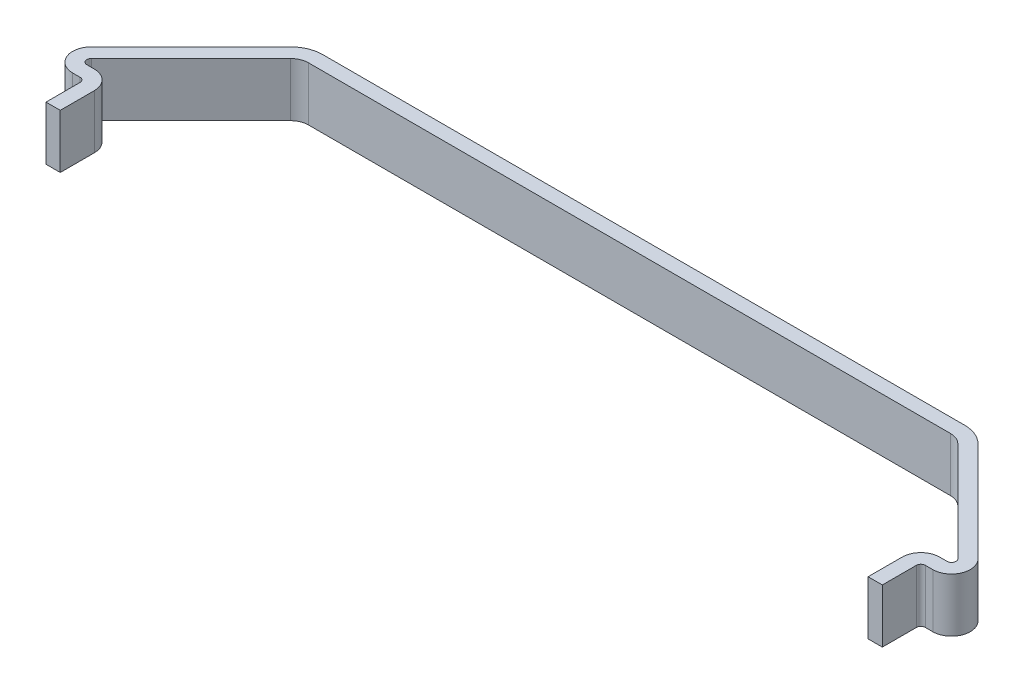
ISO-10303-21;
HEADER;
FILE_DESCRIPTION(('STEP AP214'),'2;1');
FILE_NAME('part.step','',(''),(''),'','','');
FILE_SCHEMA(('AUTOMOTIVE_DESIGN { 1 0 10303 214 1 1 1 1 }'));
ENDSEC;
DATA;
#1=APPLICATION_CONTEXT('core data for automotive mechanical design processes');
#2=APPLICATION_PROTOCOL_DEFINITION('international standard','automotive_design',2000,#1);
#3=PRODUCT_CONTEXT('',#1,'mechanical');
#4=PRODUCT('Part','Part','',(#3));
#5=PRODUCT_RELATED_PRODUCT_CATEGORY('part','',(#4));
#6=PRODUCT_DEFINITION_FORMATION('','',#4);
#7=PRODUCT_DEFINITION_CONTEXT('part definition',#1,'design');
#8=PRODUCT_DEFINITION('design','',#6,#7);
#9=PRODUCT_DEFINITION_SHAPE('','',#8);
#10=(LENGTH_UNIT() NAMED_UNIT(*) SI_UNIT(.MILLI.,.METRE.));
#11=(NAMED_UNIT(*) PLANE_ANGLE_UNIT() SI_UNIT($,.RADIAN.));
#12=(NAMED_UNIT(*) SI_UNIT($,.STERADIAN.) SOLID_ANGLE_UNIT());
#13=UNCERTAINTY_MEASURE_WITH_UNIT(LENGTH_MEASURE(1.E-05),#10,'distance_accuracy_value','');
#14=(GEOMETRIC_REPRESENTATION_CONTEXT(3) GLOBAL_UNCERTAINTY_ASSIGNED_CONTEXT((#13)) GLOBAL_UNIT_ASSIGNED_CONTEXT((#10,
#11,#12)) REPRESENTATION_CONTEXT('',''));
#15=CARTESIAN_POINT('',(0.,0.,0.));
#16=DIRECTION('',(0.,0.,1.));
#17=DIRECTION('',(1.,0.,0.));
#18=AXIS2_PLACEMENT_3D('',#15,#16,#17);
#19=CARTESIAN_POINT('',(-17.8795364376269,1.5,-10.70625));
#20=DIRECTION('',(0.,-1.,0.));
#21=DIRECTION('',(0.,0.,-1.));
#22=AXIS2_PLACEMENT_3D('',#19,#20,#21);
#23=CYLINDRICAL_SURFACE('',#22,1.79375);
#24=CARTESIAN_POINT('',(-17.8795364376269,-1.5,-10.70625));
#25=DIRECTION('',(0.,1.,0.));
#26=DIRECTION('',(0.,0.,1.));
#27=AXIS2_PLACEMENT_3D('',#24,#25,#26);
#28=CIRCLE('',#27,1.79375);
#29=CARTESIAN_POINT('',(-17.8795364376269,-1.5,-12.5));
#30=VERTEX_POINT('',#29);
#31=CARTESIAN_POINT('',(-19.1479092263802,-1.5,-11.9746227887534));
#32=VERTEX_POINT('',#31);
#33=EDGE_CURVE('E260',#30,#32,#28,.T.);
#34=ORIENTED_EDGE('',*,*,#33,.T.);
#35=DIRECTION('',(0.,-1.,0.));
#36=VECTOR('',#35,1.);
#37=CARTESIAN_POINT('',(-19.1479092263802,1.5,-11.9746227887534));
#38=LINE('',#37,#36);
#39=CARTESIAN_POINT('',(-19.1479092263802,1.5,-11.9746227887534));
#40=VERTEX_POINT('',#39);
#41=EDGE_CURVE('E11',#40,#32,#38,.T.);
#42=ORIENTED_EDGE('',*,*,#41,.F.);
#43=CARTESIAN_POINT('',(-17.8795364376269,1.5,-10.70625));
#44=DIRECTION('',(0.,1.,0.));
#45=DIRECTION('',(0.,0.,1.));
#46=AXIS2_PLACEMENT_3D('',#43,#44,#45);
#47=CIRCLE('',#46,1.79375);
#48=CARTESIAN_POINT('',(-17.8795364376269,1.5,-12.5));
#49=VERTEX_POINT('',#48);
#50=EDGE_CURVE('E342',#49,#40,#47,.T.);
#51=ORIENTED_EDGE('',*,*,#50,.F.);
#52=DIRECTION('',(0.,-1.,0.));
#53=VECTOR('',#52,1.);
#54=CARTESIAN_POINT('',(-17.8795364376269,1.5,-12.5));
#55=LINE('',#54,#53);
#56=EDGE_CURVE('E256',#49,#30,#55,.T.);
#57=ORIENTED_EDGE('',*,*,#56,.T.);
#58=EDGE_LOOP('',(#34,#42,#51,#57));
#59=FACE_BOUND('',#58,.T.);
#60=ADVANCED_FACE('F39',(#59),#23,.T.);
#61=CARTESIAN_POINT('',(-19.1479092263802,1.5,-11.9746227887534));
#62=DIRECTION('',(0.707106781186544,0.,0.707106781186551));
#63=DIRECTION('',(0.707106781186551,0.,-0.707106781186544));
#64=AXIS2_PLACEMENT_3D('',#61,#62,#63);
#65=PLANE('',#64);
#66=DIRECTION('',(-0.707106781186551,0.,0.707106781186544));
#67=VECTOR('',#66,1.);
#68=CARTESIAN_POINT('',(-19.1479092263802,-1.5,-11.9746227887534));
#69=LINE('',#68,#67);
#70=CARTESIAN_POINT('',(-24.6942927028635,-1.5,-6.42823931227021));
#71=VERTEX_POINT('',#70);
#72=EDGE_CURVE('E264',#32,#71,#69,.T.);
#73=ORIENTED_EDGE('',*,*,#72,.T.);
#74=DIRECTION('',(0.,-1.,0.));
#75=VECTOR('',#74,1.);
#76=CARTESIAN_POINT('',(-24.6942927028635,1.5,-6.42823931227021));
#77=LINE('',#76,#75);
#78=CARTESIAN_POINT('',(-24.6942927028635,1.5,-6.42823931227021));
#79=VERTEX_POINT('',#78);
#80=EDGE_CURVE('E48',#79,#71,#77,.T.);
#81=ORIENTED_EDGE('',*,*,#80,.F.);
#82=DIRECTION('',(-0.707106781186551,0.,0.707106781186544));
#83=VECTOR('',#82,1.);
#84=CARTESIAN_POINT('',(-19.1479092263802,1.5,-11.9746227887534));
#85=LINE('',#84,#83);
#86=EDGE_CURVE('E159',#40,#79,#85,.T.);
#87=ORIENTED_EDGE('',*,*,#86,.F.);
#88=ORIENTED_EDGE('',*,*,#41,.T.);
#89=EDGE_LOOP('',(#73,#81,#87,#88));
#90=FACE_BOUND('',#89,.T.);
#91=ADVANCED_FACE('F548',(#90),#65,.F.);
#92=CARTESIAN_POINT('',(-23.95625,1.5,-5.69019660940675));
#93=DIRECTION('',(0.,-1.,0.));
#94=DIRECTION('',(0.,0.,-1.));
#95=AXIS2_PLACEMENT_3D('',#92,#93,#94);
#96=CYLINDRICAL_SURFACE('',#95,1.04375);
#97=CARTESIAN_POINT('',(-23.95625,-1.5,-5.69019660940675));
#98=DIRECTION('',(0.,1.,0.));
#99=DIRECTION('',(0.,0.,-1.));
#100=AXIS2_PLACEMENT_3D('',#97,#98,#99);
#101=CIRCLE('',#100,1.04375);
#102=CARTESIAN_POINT('',(-23.95625,-1.5,-4.64644660940675));
#103=VERTEX_POINT('',#102);
#104=EDGE_CURVE('E267',#71,#103,#101,.T.);
#105=ORIENTED_EDGE('',*,*,#104,.T.);
#106=DIRECTION('',(0.,-1.,0.));
#107=VECTOR('',#106,1.);
#108=CARTESIAN_POINT('',(-23.95625,1.5,-4.64644660940675));
#109=LINE('',#108,#107);
#110=CARTESIAN_POINT('',(-23.95625,1.5,-4.64644660940675));
#111=VERTEX_POINT('',#110);
#112=EDGE_CURVE('E433',#111,#103,#109,.T.);
#113=ORIENTED_EDGE('',*,*,#112,.F.);
#114=CARTESIAN_POINT('',(-23.95625,1.5,-5.69019660940675));
#115=DIRECTION('',(0.,1.,0.));
#116=DIRECTION('',(0.,0.,-1.));
#117=AXIS2_PLACEMENT_3D('',#114,#115,#116);
#118=CIRCLE('',#117,1.04375);
#119=EDGE_CURVE('E443',#79,#111,#118,.T.);
#120=ORIENTED_EDGE('',*,*,#119,.F.);
#121=ORIENTED_EDGE('',*,*,#80,.T.);
#122=EDGE_LOOP('',(#105,#113,#120,#121));
#123=FACE_BOUND('',#122,.T.);
#124=ADVANCED_FACE('F441',(#123),#96,.T.);
#125=CARTESIAN_POINT('',(-23.95625,1.5,-4.64644660940675));
#126=DIRECTION('',(0.,0.,-1.));
#127=DIRECTION('',(-1.,0.,0.));
#128=AXIS2_PLACEMENT_3D('',#125,#126,#127);
#129=PLANE('',#128);
#130=DIRECTION('',(1.,0.,0.));
#131=VECTOR('',#130,1.);
#132=CARTESIAN_POINT('',(-23.95625,-1.5,-4.64644660940675));
#133=LINE('',#132,#131);
#134=CARTESIAN_POINT('',(-23.54375,-1.5,-4.64644660940675));
#135=VERTEX_POINT('',#134);
#136=EDGE_CURVE('E270',#103,#135,#133,.T.);
#137=ORIENTED_EDGE('',*,*,#136,.T.);
#138=DIRECTION('',(0.,-1.,0.));
#139=VECTOR('',#138,1.);
#140=CARTESIAN_POINT('',(-23.54375,1.5,-4.64644660940675));
#141=LINE('',#140,#139);
#142=CARTESIAN_POINT('',(-23.54375,1.5,-4.64644660940675));
#143=VERTEX_POINT('',#142);
#144=EDGE_CURVE('E429',#143,#135,#141,.T.);
#145=ORIENTED_EDGE('',*,*,#144,.F.);
#146=DIRECTION('',(1.,0.,0.));
#147=VECTOR('',#146,1.);
#148=CARTESIAN_POINT('',(-23.95625,1.5,-4.64644660940675));
#149=LINE('',#148,#147);
#150=EDGE_CURVE('E462',#111,#143,#149,.T.);
#151=ORIENTED_EDGE('',*,*,#150,.F.);
#152=ORIENTED_EDGE('',*,*,#112,.T.);
#153=EDGE_LOOP('',(#137,#145,#151,#152));
#154=FACE_BOUND('',#153,.T.);
#155=ADVANCED_FACE('F452',(#154),#129,.F.);
#156=CARTESIAN_POINT('',(-23.54375,1.5,-4.39644660940675));
#157=DIRECTION('',(0.,-1.,0.));
#158=DIRECTION('',(0.,0.,-1.));
#159=AXIS2_PLACEMENT_3D('',#156,#157,#158);
#160=CYLINDRICAL_SURFACE('',#159,0.25);
#161=CARTESIAN_POINT('',(-23.54375,-1.5,-4.39644660940675));
#162=DIRECTION('',(0.,-1.,0.));
#163=DIRECTION('',(0.,0.,-1.));
#164=AXIS2_PLACEMENT_3D('',#161,#162,#163);
#165=CIRCLE('',#164,0.25);
#166=CARTESIAN_POINT('',(-23.29375,-1.5,-4.39644660940675));
#167=VERTEX_POINT('',#166);
#168=EDGE_CURVE('E273',#135,#167,#165,.T.);
#169=ORIENTED_EDGE('',*,*,#168,.T.);
#170=DIRECTION('',(0.,-1.,0.));
#171=VECTOR('',#170,1.);
#172=CARTESIAN_POINT('',(-23.29375,1.5,-4.39644660940675));
#173=LINE('',#172,#171);
#174=CARTESIAN_POINT('',(-23.29375,1.5,-4.39644660940675));
#175=VERTEX_POINT('',#174);
#176=EDGE_CURVE('E425',#175,#167,#173,.T.);
#177=ORIENTED_EDGE('',*,*,#176,.F.);
#178=CARTESIAN_POINT('',(-23.54375,1.5,-4.39644660940675));
#179=DIRECTION('',(0.,-1.,0.));
#180=DIRECTION('',(0.,0.,-1.));
#181=AXIS2_PLACEMENT_3D('',#178,#179,#180);
#182=CIRCLE('',#181,0.25);
#183=EDGE_CURVE('E458',#143,#175,#182,.T.);
#184=ORIENTED_EDGE('',*,*,#183,.F.);
#185=ORIENTED_EDGE('',*,*,#144,.T.);
#186=EDGE_LOOP('',(#169,#177,#184,#185));
#187=FACE_BOUND('',#186,.T.);
#188=ADVANCED_FACE('F456',(#187),#160,.F.);
#189=CARTESIAN_POINT('',(-23.29375,1.5,-4.39644660940675));
#190=DIRECTION('',(1.,0.,0.));
#191=DIRECTION('',(0.,0.,-1.));
#192=AXIS2_PLACEMENT_3D('',#189,#190,#191);
#193=PLANE('',#192);
#194=DIRECTION('',(0.,0.,1.));
#195=VECTOR('',#194,1.);
#196=CARTESIAN_POINT('',(-23.29375,-1.5,-4.39644660940675));
#197=LINE('',#196,#195);
#198=CARTESIAN_POINT('',(-23.29375,-1.5,-2.5));
#199=VERTEX_POINT('',#198);
#200=EDGE_CURVE('E276',#167,#199,#197,.T.);
#201=ORIENTED_EDGE('',*,*,#200,.T.);
#202=DIRECTION('',(0.,-1.,0.));
#203=VECTOR('',#202,1.);
#204=CARTESIAN_POINT('',(-23.29375,1.5,-2.5));
#205=LINE('',#204,#203);
#206=CARTESIAN_POINT('',(-23.29375,1.5,-2.5));
#207=VERTEX_POINT('',#206);
#208=EDGE_CURVE('E421',#207,#199,#205,.T.);
#209=ORIENTED_EDGE('',*,*,#208,.F.);
#210=DIRECTION('',(0.,0.,1.));
#211=VECTOR('',#210,1.);
#212=CARTESIAN_POINT('',(-23.29375,1.5,-4.39644660940675));
#213=LINE('',#212,#211);
#214=EDGE_CURVE('E461',#175,#207,#213,.T.);
#215=ORIENTED_EDGE('',*,*,#214,.F.);
#216=ORIENTED_EDGE('',*,*,#176,.T.);
#217=EDGE_LOOP('',(#201,#209,#215,#216));
#218=FACE_BOUND('',#217,.T.);
#219=ADVANCED_FACE('F561',(#218),#193,.F.);
#220=CARTESIAN_POINT('',(-23.29375,1.5,-2.5));
#221=DIRECTION('',(0.,0.,-1.));
#222=DIRECTION('',(-1.,0.,0.));
#223=AXIS2_PLACEMENT_3D('',#220,#221,#222);
#224=PLANE('',#223);
#225=DIRECTION('',(1.,0.,0.));
#226=VECTOR('',#225,1.);
#227=CARTESIAN_POINT('',(-23.29375,-1.5,-2.5));
#228=LINE('',#227,#226);
#229=CARTESIAN_POINT('',(-22.5,-1.5,-2.5));
#230=VERTEX_POINT('',#229);
#231=EDGE_CURVE('E279',#199,#230,#228,.T.);
#232=ORIENTED_EDGE('',*,*,#231,.T.);
#233=DIRECTION('',(0.,-1.,0.));
#234=VECTOR('',#233,1.);
#235=CARTESIAN_POINT('',(-22.5,1.5,-2.5));
#236=LINE('',#235,#234);
#237=CARTESIAN_POINT('',(-22.5,1.5,-2.5));
#238=VERTEX_POINT('',#237);
#239=EDGE_CURVE('E417',#238,#230,#236,.T.);
#240=ORIENTED_EDGE('',*,*,#239,.F.);
#241=DIRECTION('',(1.,0.,0.));
#242=VECTOR('',#241,1.);
#243=CARTESIAN_POINT('',(-23.29375,1.5,-2.5));
#244=LINE('',#243,#242);
#245=EDGE_CURVE('E466',#207,#238,#244,.T.);
#246=ORIENTED_EDGE('',*,*,#245,.F.);
#247=ORIENTED_EDGE('',*,*,#208,.T.);
#248=EDGE_LOOP('',(#232,#240,#246,#247));
#249=FACE_BOUND('',#248,.T.);
#250=ADVANCED_FACE('F564',(#249),#224,.F.);
#251=CARTESIAN_POINT('',(-22.5,1.5,-4.39644660940675));
#252=DIRECTION('',(-1.,0.,0.));
#253=DIRECTION('',(0.,0.,1.));
#254=AXIS2_PLACEMENT_3D('',#251,#252,#253);
#255=PLANE('',#254);
#256=DIRECTION('',(0.,0.,-1.));
#257=VECTOR('',#256,1.);
#258=CARTESIAN_POINT('',(-22.5,-1.5,-4.39644660940675));
#259=LINE('',#258,#257);
#260=CARTESIAN_POINT('',(-22.5,-1.5,-4.39644660940675));
#261=VERTEX_POINT('',#260);
#262=EDGE_CURVE('E282',#230,#261,#259,.T.);
#263=ORIENTED_EDGE('',*,*,#262,.T.);
#264=DIRECTION('',(0.,-1.,0.));
#265=VECTOR('',#264,1.);
#266=CARTESIAN_POINT('',(-22.5,1.5,-4.39644660940675));
#267=LINE('',#266,#265);
#268=CARTESIAN_POINT('',(-22.5,1.5,-4.39644660940675));
#269=VERTEX_POINT('',#268);
#270=EDGE_CURVE('E413',#269,#261,#267,.T.);
#271=ORIENTED_EDGE('',*,*,#270,.F.);
#272=DIRECTION('',(0.,0.,-1.));
#273=VECTOR('',#272,1.);
#274=CARTESIAN_POINT('',(-22.5,1.5,-4.39644660940675));
#275=LINE('',#274,#273);
#276=EDGE_CURVE('E473',#238,#269,#275,.T.);
#277=ORIENTED_EDGE('',*,*,#276,.F.);
#278=ORIENTED_EDGE('',*,*,#239,.T.);
#279=EDGE_LOOP('',(#263,#271,#277,#278));
#280=FACE_BOUND('',#279,.T.);
#281=ADVANCED_FACE('F568',(#280),#255,.F.);
#282=CARTESIAN_POINT('',(-23.54375,1.5,-4.39644660940675));
#283=DIRECTION('',(0.,-1.,0.));
#284=DIRECTION('',(0.,0.,-1.));
#285=AXIS2_PLACEMENT_3D('',#282,#283,#284);
#286=CYLINDRICAL_SURFACE('',#285,1.04375);
#287=CARTESIAN_POINT('',(-23.54375,-1.5,-4.39644660940675));
#288=DIRECTION('',(0.,1.,0.));
#289=DIRECTION('',(0.,0.,-1.));
#290=AXIS2_PLACEMENT_3D('',#287,#288,#289);
#291=CIRCLE('',#290,1.04375);
#292=CARTESIAN_POINT('',(-23.54375,-1.5,-5.44019660940675));
#293=VERTEX_POINT('',#292);
#294=EDGE_CURVE('E285',#261,#293,#291,.T.);
#295=ORIENTED_EDGE('',*,*,#294,.T.);
#296=DIRECTION('',(0.,-1.,0.));
#297=VECTOR('',#296,1.);
#298=CARTESIAN_POINT('',(-23.54375,1.5,-5.44019660940675));
#299=LINE('',#298,#297);
#300=CARTESIAN_POINT('',(-23.54375,1.5,-5.44019660940675));
#301=VERTEX_POINT('',#300);
#302=EDGE_CURVE('E409',#301,#293,#299,.T.);
#303=ORIENTED_EDGE('',*,*,#302,.F.);
#304=CARTESIAN_POINT('',(-23.54375,1.5,-4.39644660940675));
#305=DIRECTION('',(0.,1.,0.));
#306=DIRECTION('',(0.,0.,-1.));
#307=AXIS2_PLACEMENT_3D('',#304,#305,#306);
#308=CIRCLE('',#307,1.04375);
#309=EDGE_CURVE('E476',#269,#301,#308,.T.);
#310=ORIENTED_EDGE('',*,*,#309,.F.);
#311=ORIENTED_EDGE('',*,*,#270,.T.);
#312=EDGE_LOOP('',(#295,#303,#310,#311));
#313=FACE_BOUND('',#312,.T.);
#314=ADVANCED_FACE('F572',(#313),#286,.T.);
#315=CARTESIAN_POINT('',(-23.95625,1.5,-5.44019660940675));
#316=DIRECTION('',(0.,0.,1.));
#317=DIRECTION('',(1.,0.,0.));
#318=AXIS2_PLACEMENT_3D('',#315,#316,#317);
#319=PLANE('',#318);
#320=DIRECTION('',(-1.,0.,0.));
#321=VECTOR('',#320,1.);
#322=CARTESIAN_POINT('',(-23.95625,-1.5,-5.44019660940675));
#323=LINE('',#322,#321);
#324=CARTESIAN_POINT('',(-23.95625,-1.5,-5.44019660940675));
#325=VERTEX_POINT('',#324);
#326=EDGE_CURVE('E288',#293,#325,#323,.T.);
#327=ORIENTED_EDGE('',*,*,#326,.T.);
#328=DIRECTION('',(0.,-1.,0.));
#329=VECTOR('',#328,1.);
#330=CARTESIAN_POINT('',(-23.95625,1.5,-5.44019660940675));
#331=LINE('',#330,#329);
#332=CARTESIAN_POINT('',(-23.95625,1.5,-5.44019660940675));
#333=VERTEX_POINT('',#332);
#334=EDGE_CURVE('E405',#333,#325,#331,.T.);
#335=ORIENTED_EDGE('',*,*,#334,.F.);
#336=DIRECTION('',(-1.,0.,0.));
#337=VECTOR('',#336,1.);
#338=CARTESIAN_POINT('',(-23.95625,1.5,-5.44019660940675));
#339=LINE('',#338,#337);
#340=EDGE_CURVE('E479',#301,#333,#339,.T.);
#341=ORIENTED_EDGE('',*,*,#340,.F.);
#342=ORIENTED_EDGE('',*,*,#302,.T.);
#343=EDGE_LOOP('',(#327,#335,#341,#342));
#344=FACE_BOUND('',#343,.T.);
#345=ADVANCED_FACE('F576',(#344),#319,.F.);
#346=CARTESIAN_POINT('',(-23.95625,1.5,-5.69019660940675));
#347=DIRECTION('',(0.,-1.,0.));
#348=DIRECTION('',(0.,0.,-1.));
#349=AXIS2_PLACEMENT_3D('',#346,#347,#348);
#350=CYLINDRICAL_SURFACE('',#349,0.249999999999999);
#351=CARTESIAN_POINT('',(-23.95625,-1.5,-5.69019660940675));
#352=DIRECTION('',(0.,-1.,0.));
#353=DIRECTION('',(0.,0.,1.));
#354=AXIS2_PLACEMENT_3D('',#351,#352,#353);
#355=CIRCLE('',#354,0.249999999999999);
#356=CARTESIAN_POINT('',(-24.1330266952966,-1.5,-5.86697330470339));
#357=VERTEX_POINT('',#356);
#358=EDGE_CURVE('E291',#325,#357,#355,.T.);
#359=ORIENTED_EDGE('',*,*,#358,.T.);
#360=DIRECTION('',(0.,-1.,0.));
#361=VECTOR('',#360,1.);
#362=CARTESIAN_POINT('',(-24.1330266952966,1.5,-5.86697330470339));
#363=LINE('',#362,#361);
#364=CARTESIAN_POINT('',(-24.1330266952966,1.5,-5.86697330470339));
#365=VERTEX_POINT('',#364);
#366=EDGE_CURVE('E401',#365,#357,#363,.T.);
#367=ORIENTED_EDGE('',*,*,#366,.F.);
#368=CARTESIAN_POINT('',(-23.95625,1.5,-5.69019660940675));
#369=DIRECTION('',(0.,-1.,0.));
#370=DIRECTION('',(0.,0.,1.));
#371=AXIS2_PLACEMENT_3D('',#368,#369,#370);
#372=CIRCLE('',#371,0.249999999999999);
#373=EDGE_CURVE('E482',#333,#365,#372,.T.);
#374=ORIENTED_EDGE('',*,*,#373,.F.);
#375=ORIENTED_EDGE('',*,*,#334,.T.);
#376=EDGE_LOOP('',(#359,#367,#374,#375));
#377=FACE_BOUND('',#376,.T.);
#378=ADVANCED_FACE('F580',(#377),#350,.F.);
#379=CARTESIAN_POINT('',(-18.5866432188134,1.5,-11.4133567811866));
#380=DIRECTION('',(-0.707106781186544,0.,-0.707106781186551));
#381=DIRECTION('',(-0.707106781186551,0.,0.707106781186544));
#382=AXIS2_PLACEMENT_3D('',#379,#380,#381);
#383=PLANE('',#382);
#384=DIRECTION('',(0.707106781186551,0.,-0.707106781186544));
#385=VECTOR('',#384,1.);
#386=CARTESIAN_POINT('',(-18.5866432188134,-1.5,-11.4133567811866));
#387=LINE('',#386,#385);
#388=CARTESIAN_POINT('',(-18.5866432188134,-1.5,-11.4133567811865));
#389=VERTEX_POINT('',#388);
#390=EDGE_CURVE('E294',#357,#389,#387,.T.);
#391=ORIENTED_EDGE('',*,*,#390,.T.);
#392=DIRECTION('',(0.,-1.,0.));
#393=VECTOR('',#392,1.);
#394=CARTESIAN_POINT('',(-18.5866432188134,1.5,-11.4133567811865));
#395=LINE('',#394,#393);
#396=CARTESIAN_POINT('',(-18.5866432188134,1.5,-11.4133567811865));
#397=VERTEX_POINT('',#396);
#398=EDGE_CURVE('E397',#397,#389,#395,.T.);
#399=ORIENTED_EDGE('',*,*,#398,.F.);
#400=DIRECTION('',(0.707106781186551,0.,-0.707106781186544));
#401=VECTOR('',#400,1.);
#402=CARTESIAN_POINT('',(-18.5866432188134,1.5,-11.4133567811866));
#403=LINE('',#402,#401);
#404=EDGE_CURVE('E485',#365,#397,#403,.T.);
#405=ORIENTED_EDGE('',*,*,#404,.F.);
#406=ORIENTED_EDGE('',*,*,#366,.T.);
#407=EDGE_LOOP('',(#391,#399,#405,#406));
#408=FACE_BOUND('',#407,.T.);
#409=ADVANCED_FACE('F584',(#408),#383,.F.);
#410=CARTESIAN_POINT('',(-17.8795364376269,1.5,-10.70625));
#411=DIRECTION('',(0.,-1.,0.));
#412=DIRECTION('',(0.,0.,-1.));
#413=AXIS2_PLACEMENT_3D('',#410,#411,#412);
#414=CYLINDRICAL_SURFACE('',#413,0.999999999999997);
#415=CARTESIAN_POINT('',(-17.8795364376269,-1.5,-10.70625));
#416=DIRECTION('',(0.,-1.,0.));
#417=DIRECTION('',(0.,0.,1.));
#418=AXIS2_PLACEMENT_3D('',#415,#416,#417);
#419=CIRCLE('',#418,0.999999999999997);
#420=CARTESIAN_POINT('',(-17.8795364376269,-1.5,-11.70625));
#421=VERTEX_POINT('',#420);
#422=EDGE_CURVE('E297',#389,#421,#419,.T.);
#423=ORIENTED_EDGE('',*,*,#422,.T.);
#424=DIRECTION('',(0.,-1.,0.));
#425=VECTOR('',#424,1.);
#426=CARTESIAN_POINT('',(-17.8795364376269,1.5,-11.70625));
#427=LINE('',#426,#425);
#428=CARTESIAN_POINT('',(-17.8795364376269,1.5,-11.70625));
#429=VERTEX_POINT('',#428);
#430=EDGE_CURVE('E393',#429,#421,#427,.T.);
#431=ORIENTED_EDGE('',*,*,#430,.F.);
#432=CARTESIAN_POINT('',(-17.8795364376269,1.5,-10.70625));
#433=DIRECTION('',(0.,-1.,0.));
#434=DIRECTION('',(0.,0.,1.));
#435=AXIS2_PLACEMENT_3D('',#432,#433,#434);
#436=CIRCLE('',#435,0.999999999999997);
#437=EDGE_CURVE('E488',#397,#429,#436,.T.);
#438=ORIENTED_EDGE('',*,*,#437,.F.);
#439=ORIENTED_EDGE('',*,*,#398,.T.);
#440=EDGE_LOOP('',(#423,#431,#438,#439));
#441=FACE_BOUND('',#440,.T.);
#442=ADVANCED_FACE('F588',(#441),#414,.F.);
#443=CARTESIAN_POINT('',(17.8795364376269,1.5,-11.70625));
#444=DIRECTION('',(0.,0.,-1.));
#445=DIRECTION('',(-1.,0.,0.));
#446=AXIS2_PLACEMENT_3D('',#443,#444,#445);
#447=PLANE('',#446);
#448=DIRECTION('',(1.,0.,0.));
#449=VECTOR('',#448,1.);
#450=CARTESIAN_POINT('',(17.8795364376269,-1.5,-11.70625));
#451=LINE('',#450,#449);
#452=CARTESIAN_POINT('',(17.8795364376269,-1.5,-11.70625));
#453=VERTEX_POINT('',#452);
#454=EDGE_CURVE('E300',#421,#453,#451,.T.);
#455=ORIENTED_EDGE('',*,*,#454,.T.);
#456=DIRECTION('',(0.,-1.,0.));
#457=VECTOR('',#456,1.);
#458=CARTESIAN_POINT('',(17.8795364376269,1.5,-11.70625));
#459=LINE('',#458,#457);
#460=CARTESIAN_POINT('',(17.8795364376269,1.5,-11.70625));
#461=VERTEX_POINT('',#460);
#462=EDGE_CURVE('E389',#461,#453,#459,.T.);
#463=ORIENTED_EDGE('',*,*,#462,.F.);
#464=DIRECTION('',(1.,0.,0.));
#465=VECTOR('',#464,1.);
#466=CARTESIAN_POINT('',(17.8795364376269,1.5,-11.70625));
#467=LINE('',#466,#465);
#468=EDGE_CURVE('E491',#429,#461,#467,.T.);
#469=ORIENTED_EDGE('',*,*,#468,.F.);
#470=ORIENTED_EDGE('',*,*,#430,.T.);
#471=EDGE_LOOP('',(#455,#463,#469,#470));
#472=FACE_BOUND('',#471,.T.);
#473=ADVANCED_FACE('F592',(#472),#447,.F.);
#474=CARTESIAN_POINT('',(17.8795364376269,1.5,-10.70625));
#475=DIRECTION('',(0.,-1.,0.));
#476=DIRECTION('',(0.,0.,-1.));
#477=AXIS2_PLACEMENT_3D('',#474,#475,#476);
#478=CYLINDRICAL_SURFACE('',#477,0.999999999999998);
#479=CARTESIAN_POINT('',(17.8795364376269,-1.5,-10.70625));
#480=DIRECTION('',(0.,-1.,0.));
#481=DIRECTION('',(0.,0.,-1.));
#482=AXIS2_PLACEMENT_3D('',#479,#480,#481);
#483=CIRCLE('',#482,0.999999999999998);
#484=CARTESIAN_POINT('',(18.5866432188134,-1.5,-11.4133567811866));
#485=VERTEX_POINT('',#484);
#486=EDGE_CURVE('E303',#453,#485,#483,.T.);
#487=ORIENTED_EDGE('',*,*,#486,.T.);
#488=DIRECTION('',(0.,-1.,0.));
#489=VECTOR('',#488,1.);
#490=CARTESIAN_POINT('',(18.5866432188134,1.5,-11.4133567811866));
#491=LINE('',#490,#489);
#492=CARTESIAN_POINT('',(18.5866432188134,1.5,-11.4133567811866));
#493=VERTEX_POINT('',#492);
#494=EDGE_CURVE('E385',#493,#485,#491,.T.);
#495=ORIENTED_EDGE('',*,*,#494,.F.);
#496=CARTESIAN_POINT('',(17.8795364376269,1.5,-10.70625));
#497=DIRECTION('',(0.,-1.,0.));
#498=DIRECTION('',(0.,0.,-1.));
#499=AXIS2_PLACEMENT_3D('',#496,#497,#498);
#500=CIRCLE('',#499,0.999999999999998);
#501=EDGE_CURVE('E494',#461,#493,#500,.T.);
#502=ORIENTED_EDGE('',*,*,#501,.F.);
#503=ORIENTED_EDGE('',*,*,#462,.T.);
#504=EDGE_LOOP('',(#487,#495,#502,#503));
#505=FACE_BOUND('',#504,.T.);
#506=ADVANCED_FACE('F596',(#505),#478,.F.);
#507=CARTESIAN_POINT('',(18.5866432188134,1.5,-11.4133567811866));
#508=DIRECTION('',(0.707106781186544,0.,-0.707106781186551));
#509=DIRECTION('',(-0.707106781186551,0.,-0.707106781186544));
#510=AXIS2_PLACEMENT_3D('',#507,#508,#509);
#511=PLANE('',#510);
#512=DIRECTION('',(0.707106781186551,0.,0.707106781186544));
#513=VECTOR('',#512,1.);
#514=CARTESIAN_POINT('',(18.5866432188134,-1.5,-11.4133567811866));
#515=LINE('',#514,#513);
#516=CARTESIAN_POINT('',(24.1330266952966,-1.5,-5.86697330470339));
#517=VERTEX_POINT('',#516);
#518=EDGE_CURVE('E306',#485,#517,#515,.T.);
#519=ORIENTED_EDGE('',*,*,#518,.T.);
#520=DIRECTION('',(0.,-1.,0.));
#521=VECTOR('',#520,1.);
#522=CARTESIAN_POINT('',(24.1330266952966,1.5,-5.86697330470339));
#523=LINE('',#522,#521);
#524=CARTESIAN_POINT('',(24.1330266952966,1.5,-5.86697330470339));
#525=VERTEX_POINT('',#524);
#526=EDGE_CURVE('E381',#525,#517,#523,.T.);
#527=ORIENTED_EDGE('',*,*,#526,.F.);
#528=DIRECTION('',(0.707106781186551,0.,0.707106781186544));
#529=VECTOR('',#528,1.);
#530=CARTESIAN_POINT('',(18.5866432188134,1.5,-11.4133567811866));
#531=LINE('',#530,#529);
#532=EDGE_CURVE('E497',#493,#525,#531,.T.);
#533=ORIENTED_EDGE('',*,*,#532,.F.);
#534=ORIENTED_EDGE('',*,*,#494,.T.);
#535=EDGE_LOOP('',(#519,#527,#533,#534));
#536=FACE_BOUND('',#535,.T.);
#537=ADVANCED_FACE('F600',(#536),#511,.F.);
#538=CARTESIAN_POINT('',(23.95625,1.5,-5.69019660940675));
#539=DIRECTION('',(0.,-1.,0.));
#540=DIRECTION('',(0.,0.,-1.));
#541=AXIS2_PLACEMENT_3D('',#538,#539,#540);
#542=CYLINDRICAL_SURFACE('',#541,0.249999999999999);
#543=CARTESIAN_POINT('',(23.95625,-1.5,-5.69019660940675));
#544=DIRECTION('',(0.,-1.,0.));
#545=DIRECTION('',(0.,0.,-1.));
#546=AXIS2_PLACEMENT_3D('',#543,#544,#545);
#547=CIRCLE('',#546,0.249999999999999);
#548=CARTESIAN_POINT('',(23.95625,-1.5,-5.44019660940675));
#549=VERTEX_POINT('',#548);
#550=EDGE_CURVE('E309',#517,#549,#547,.T.);
#551=ORIENTED_EDGE('',*,*,#550,.T.);
#552=DIRECTION('',(0.,-1.,0.));
#553=VECTOR('',#552,1.);
#554=CARTESIAN_POINT('',(23.95625,1.5,-5.44019660940675));
#555=LINE('',#554,#553);
#556=CARTESIAN_POINT('',(23.95625,1.5,-5.44019660940675));
#557=VERTEX_POINT('',#556);
#558=EDGE_CURVE('E377',#557,#549,#555,.T.);
#559=ORIENTED_EDGE('',*,*,#558,.F.);
#560=CARTESIAN_POINT('',(23.95625,1.5,-5.69019660940675));
#561=DIRECTION('',(0.,-1.,0.));
#562=DIRECTION('',(0.,0.,-1.));
#563=AXIS2_PLACEMENT_3D('',#560,#561,#562);
#564=CIRCLE('',#563,0.249999999999999);
#565=EDGE_CURVE('E500',#525,#557,#564,.T.);
#566=ORIENTED_EDGE('',*,*,#565,.F.);
#567=ORIENTED_EDGE('',*,*,#526,.T.);
#568=EDGE_LOOP('',(#551,#559,#566,#567));
#569=FACE_BOUND('',#568,.T.);
#570=ADVANCED_FACE('F604',(#569),#542,.F.);
#571=CARTESIAN_POINT('',(23.95625,1.5,-5.44019660940675));
#572=DIRECTION('',(0.,0.,1.));
#573=DIRECTION('',(1.,0.,0.));
#574=AXIS2_PLACEMENT_3D('',#571,#572,#573);
#575=PLANE('',#574);
#576=DIRECTION('',(-1.,0.,0.));
#577=VECTOR('',#576,1.);
#578=CARTESIAN_POINT('',(23.95625,-1.5,-5.44019660940675));
#579=LINE('',#578,#577);
#580=CARTESIAN_POINT('',(23.54375,-1.5,-5.44019660940675));
#581=VERTEX_POINT('',#580);
#582=EDGE_CURVE('E312',#549,#581,#579,.T.);
#583=ORIENTED_EDGE('',*,*,#582,.T.);
#584=DIRECTION('',(0.,-1.,0.));
#585=VECTOR('',#584,1.);
#586=CARTESIAN_POINT('',(23.54375,1.5,-5.44019660940675));
#587=LINE('',#586,#585);
#588=CARTESIAN_POINT('',(23.54375,1.5,-5.44019660940675));
#589=VERTEX_POINT('',#588);
#590=EDGE_CURVE('E373',#589,#581,#587,.T.);
#591=ORIENTED_EDGE('',*,*,#590,.F.);
#592=DIRECTION('',(-1.,0.,0.));
#593=VECTOR('',#592,1.);
#594=CARTESIAN_POINT('',(23.95625,1.5,-5.44019660940675));
#595=LINE('',#594,#593);
#596=EDGE_CURVE('E503',#557,#589,#595,.T.);
#597=ORIENTED_EDGE('',*,*,#596,.F.);
#598=ORIENTED_EDGE('',*,*,#558,.T.);
#599=EDGE_LOOP('',(#583,#591,#597,#598));
#600=FACE_BOUND('',#599,.T.);
#601=ADVANCED_FACE('F608',(#600),#575,.F.);
#602=CARTESIAN_POINT('',(23.54375,1.5,-4.39644660940675));
#603=DIRECTION('',(0.,-1.,0.));
#604=DIRECTION('',(0.,0.,-1.));
#605=AXIS2_PLACEMENT_3D('',#602,#603,#604);
#606=CYLINDRICAL_SURFACE('',#605,1.04375);
#607=CARTESIAN_POINT('',(23.54375,-1.5,-4.39644660940675));
#608=DIRECTION('',(0.,1.,0.));
#609=DIRECTION('',(0.,0.,1.));
#610=AXIS2_PLACEMENT_3D('',#607,#608,#609);
#611=CIRCLE('',#610,1.04375);
#612=CARTESIAN_POINT('',(22.5,-1.5,-4.39644660940675));
#613=VERTEX_POINT('',#612);
#614=EDGE_CURVE('E315',#581,#613,#611,.T.);
#615=ORIENTED_EDGE('',*,*,#614,.T.);
#616=DIRECTION('',(0.,-1.,0.));
#617=VECTOR('',#616,1.);
#618=CARTESIAN_POINT('',(22.5,1.5,-4.39644660940675));
#619=LINE('',#618,#617);
#620=CARTESIAN_POINT('',(22.5,1.5,-4.39644660940675));
#621=VERTEX_POINT('',#620);
#622=EDGE_CURVE('E369',#621,#613,#619,.T.);
#623=ORIENTED_EDGE('',*,*,#622,.F.);
#624=CARTESIAN_POINT('',(23.54375,1.5,-4.39644660940675));
#625=DIRECTION('',(0.,1.,0.));
#626=DIRECTION('',(0.,0.,1.));
#627=AXIS2_PLACEMENT_3D('',#624,#625,#626);
#628=CIRCLE('',#627,1.04375);
#629=EDGE_CURVE('E506',#589,#621,#628,.T.);
#630=ORIENTED_EDGE('',*,*,#629,.F.);
#631=ORIENTED_EDGE('',*,*,#590,.T.);
#632=EDGE_LOOP('',(#615,#623,#630,#631));
#633=FACE_BOUND('',#632,.T.);
#634=ADVANCED_FACE('F612',(#633),#606,.T.);
#635=CARTESIAN_POINT('',(22.5,1.5,-4.39644660940675));
#636=DIRECTION('',(1.,0.,0.));
#637=DIRECTION('',(0.,0.,-1.));
#638=AXIS2_PLACEMENT_3D('',#635,#636,#637);
#639=PLANE('',#638);
#640=DIRECTION('',(0.,0.,1.));
#641=VECTOR('',#640,1.);
#642=CARTESIAN_POINT('',(22.5,-1.5,-4.39644660940675));
#643=LINE('',#642,#641);
#644=CARTESIAN_POINT('',(22.5,-1.5,-2.5));
#645=VERTEX_POINT('',#644);
#646=EDGE_CURVE('E318',#613,#645,#643,.T.);
#647=ORIENTED_EDGE('',*,*,#646,.T.);
#648=DIRECTION('',(0.,-1.,0.));
#649=VECTOR('',#648,1.);
#650=CARTESIAN_POINT('',(22.5,1.5,-2.5));
#651=LINE('',#650,#649);
#652=CARTESIAN_POINT('',(22.5,1.5,-2.5));
#653=VERTEX_POINT('',#652);
#654=EDGE_CURVE('E365',#653,#645,#651,.T.);
#655=ORIENTED_EDGE('',*,*,#654,.F.);
#656=DIRECTION('',(0.,0.,1.));
#657=VECTOR('',#656,1.);
#658=CARTESIAN_POINT('',(22.5,1.5,-4.39644660940675));
#659=LINE('',#658,#657);
#660=EDGE_CURVE('E509',#621,#653,#659,.T.);
#661=ORIENTED_EDGE('',*,*,#660,.F.);
#662=ORIENTED_EDGE('',*,*,#622,.T.);
#663=EDGE_LOOP('',(#647,#655,#661,#662));
#664=FACE_BOUND('',#663,.T.);
#665=ADVANCED_FACE('F616',(#664),#639,.F.);
#666=CARTESIAN_POINT('',(23.29375,1.5,-2.5));
#667=DIRECTION('',(0.,0.,-1.));
#668=DIRECTION('',(-1.,0.,0.));
#669=AXIS2_PLACEMENT_3D('',#666,#667,#668);
#670=PLANE('',#669);
#671=DIRECTION('',(1.,0.,0.));
#672=VECTOR('',#671,1.);
#673=CARTESIAN_POINT('',(23.29375,-1.5,-2.5));
#674=LINE('',#673,#672);
#675=CARTESIAN_POINT('',(23.29375,-1.5,-2.5));
#676=VERTEX_POINT('',#675);
#677=EDGE_CURVE('E321',#645,#676,#674,.T.);
#678=ORIENTED_EDGE('',*,*,#677,.T.);
#679=DIRECTION('',(0.,-1.,0.));
#680=VECTOR('',#679,1.);
#681=CARTESIAN_POINT('',(23.29375,1.5,-2.5));
#682=LINE('',#681,#680);
#683=CARTESIAN_POINT('',(23.29375,1.5,-2.5));
#684=VERTEX_POINT('',#683);
#685=EDGE_CURVE('E361',#684,#676,#682,.T.);
#686=ORIENTED_EDGE('',*,*,#685,.F.);
#687=DIRECTION('',(1.,0.,0.));
#688=VECTOR('',#687,1.);
#689=CARTESIAN_POINT('',(23.29375,1.5,-2.5));
#690=LINE('',#689,#688);
#691=EDGE_CURVE('E512',#653,#684,#690,.T.);
#692=ORIENTED_EDGE('',*,*,#691,.F.);
#693=ORIENTED_EDGE('',*,*,#654,.T.);
#694=EDGE_LOOP('',(#678,#686,#692,#693));
#695=FACE_BOUND('',#694,.T.);
#696=ADVANCED_FACE('F620',(#695),#670,.F.);
#697=CARTESIAN_POINT('',(23.29375,1.5,-4.39644660940675));
#698=DIRECTION('',(-1.,0.,0.));
#699=DIRECTION('',(0.,0.,1.));
#700=AXIS2_PLACEMENT_3D('',#697,#698,#699);
#701=PLANE('',#700);
#702=DIRECTION('',(0.,0.,-1.));
#703=VECTOR('',#702,1.);
#704=CARTESIAN_POINT('',(23.29375,-1.5,-4.39644660940675));
#705=LINE('',#704,#703);
#706=CARTESIAN_POINT('',(23.29375,-1.5,-4.39644660940675));
#707=VERTEX_POINT('',#706);
#708=EDGE_CURVE('E324',#676,#707,#705,.T.);
#709=ORIENTED_EDGE('',*,*,#708,.T.);
#710=DIRECTION('',(0.,-1.,0.));
#711=VECTOR('',#710,1.);
#712=CARTESIAN_POINT('',(23.29375,1.5,-4.39644660940675));
#713=LINE('',#712,#711);
#714=CARTESIAN_POINT('',(23.29375,1.5,-4.39644660940675));
#715=VERTEX_POINT('',#714);
#716=EDGE_CURVE('E357',#715,#707,#713,.T.);
#717=ORIENTED_EDGE('',*,*,#716,.F.);
#718=DIRECTION('',(0.,0.,-1.));
#719=VECTOR('',#718,1.);
#720=CARTESIAN_POINT('',(23.29375,1.5,-4.39644660940675));
#721=LINE('',#720,#719);
#722=EDGE_CURVE('E515',#684,#715,#721,.T.);
#723=ORIENTED_EDGE('',*,*,#722,.F.);
#724=ORIENTED_EDGE('',*,*,#685,.T.);
#725=EDGE_LOOP('',(#709,#717,#723,#724));
#726=FACE_BOUND('',#725,.T.);
#727=ADVANCED_FACE('F624',(#726),#701,.F.);
#728=CARTESIAN_POINT('',(23.54375,1.5,-4.39644660940675));
#729=DIRECTION('',(0.,-1.,0.));
#730=DIRECTION('',(0.,0.,-1.));
#731=AXIS2_PLACEMENT_3D('',#728,#729,#730);
#732=CYLINDRICAL_SURFACE('',#731,0.25);
#733=CARTESIAN_POINT('',(23.54375,-1.5,-4.39644660940675));
#734=DIRECTION('',(0.,-1.,0.));
#735=DIRECTION('',(0.,0.,1.));
#736=AXIS2_PLACEMENT_3D('',#733,#734,#735);
#737=CIRCLE('',#736,0.25);
#738=CARTESIAN_POINT('',(23.54375,-1.5,-4.64644660940675));
#739=VERTEX_POINT('',#738);
#740=EDGE_CURVE('E327',#707,#739,#737,.T.);
#741=ORIENTED_EDGE('',*,*,#740,.T.);
#742=DIRECTION('',(0.,-1.,0.));
#743=VECTOR('',#742,1.);
#744=CARTESIAN_POINT('',(23.54375,1.5,-4.64644660940675));
#745=LINE('',#744,#743);
#746=CARTESIAN_POINT('',(23.54375,1.5,-4.64644660940675));
#747=VERTEX_POINT('',#746);
#748=EDGE_CURVE('E353',#747,#739,#745,.T.);
#749=ORIENTED_EDGE('',*,*,#748,.F.);
#750=CARTESIAN_POINT('',(23.54375,1.5,-4.39644660940675));
#751=DIRECTION('',(0.,-1.,0.));
#752=DIRECTION('',(0.,0.,1.));
#753=AXIS2_PLACEMENT_3D('',#750,#751,#752);
#754=CIRCLE('',#753,0.25);
#755=EDGE_CURVE('E518',#715,#747,#754,.T.);
#756=ORIENTED_EDGE('',*,*,#755,.F.);
#757=ORIENTED_EDGE('',*,*,#716,.T.);
#758=EDGE_LOOP('',(#741,#749,#756,#757));
#759=FACE_BOUND('',#758,.T.);
#760=ADVANCED_FACE('F628',(#759),#732,.F.);
#761=CARTESIAN_POINT('',(23.95625,1.5,-4.64644660940675));
#762=DIRECTION('',(0.,0.,-1.));
#763=DIRECTION('',(-1.,0.,0.));
#764=AXIS2_PLACEMENT_3D('',#761,#762,#763);
#765=PLANE('',#764);
#766=DIRECTION('',(1.,0.,0.));
#767=VECTOR('',#766,1.);
#768=CARTESIAN_POINT('',(23.95625,-1.5,-4.64644660940675));
#769=LINE('',#768,#767);
#770=CARTESIAN_POINT('',(23.95625,-1.5,-4.64644660940674));
#771=VERTEX_POINT('',#770);
#772=EDGE_CURVE('E330',#739,#771,#769,.T.);
#773=ORIENTED_EDGE('',*,*,#772,.T.);
#774=DIRECTION('',(0.,-1.,0.));
#775=VECTOR('',#774,1.);
#776=CARTESIAN_POINT('',(23.95625,1.5,-4.64644660940674));
#777=LINE('',#776,#775);
#778=CARTESIAN_POINT('',(23.95625,1.5,-4.64644660940674));
#779=VERTEX_POINT('',#778);
#780=EDGE_CURVE('E349',#779,#771,#777,.T.);
#781=ORIENTED_EDGE('',*,*,#780,.F.);
#782=DIRECTION('',(1.,0.,0.));
#783=VECTOR('',#782,1.);
#784=CARTESIAN_POINT('',(23.95625,1.5,-4.64644660940675));
#785=LINE('',#784,#783);
#786=EDGE_CURVE('E521',#747,#779,#785,.T.);
#787=ORIENTED_EDGE('',*,*,#786,.F.);
#788=ORIENTED_EDGE('',*,*,#748,.T.);
#789=EDGE_LOOP('',(#773,#781,#787,#788));
#790=FACE_BOUND('',#789,.T.);
#791=ADVANCED_FACE('F529',(#790),#765,.F.);
#792=CARTESIAN_POINT('',(23.95625,1.5,-5.69019660940675));
#793=DIRECTION('',(0.,-1.,0.));
#794=DIRECTION('',(0.,0.,-1.));
#795=AXIS2_PLACEMENT_3D('',#792,#793,#794);
#796=CYLINDRICAL_SURFACE('',#795,1.04375);
#797=CARTESIAN_POINT('',(23.95625,-1.5,-5.69019660940675));
#798=DIRECTION('',(0.,1.,0.));
#799=DIRECTION('',(0.,0.,1.));
#800=AXIS2_PLACEMENT_3D('',#797,#798,#799);
#801=CIRCLE('',#800,1.04375);
#802=CARTESIAN_POINT('',(24.6942927028634,-1.5,-6.42823931227021));
#803=VERTEX_POINT('',#802);
#804=EDGE_CURVE('E333',#771,#803,#801,.T.);
#805=ORIENTED_EDGE('',*,*,#804,.T.);
#806=DIRECTION('',(0.,-1.,0.));
#807=VECTOR('',#806,1.);
#808=CARTESIAN_POINT('',(24.6942927028634,1.5,-6.42823931227021));
#809=LINE('',#808,#807);
#810=CARTESIAN_POINT('',(24.6942927028634,1.5,-6.42823931227021));
#811=VERTEX_POINT('',#810);
#812=EDGE_CURVE('E249',#811,#803,#809,.T.);
#813=ORIENTED_EDGE('',*,*,#812,.F.);
#814=CARTESIAN_POINT('',(23.95625,1.5,-5.69019660940675));
#815=DIRECTION('',(0.,1.,0.));
#816=DIRECTION('',(0.,0.,1.));
#817=AXIS2_PLACEMENT_3D('',#814,#815,#816);
#818=CIRCLE('',#817,1.04375);
#819=EDGE_CURVE('E238',#779,#811,#818,.T.);
#820=ORIENTED_EDGE('',*,*,#819,.F.);
#821=ORIENTED_EDGE('',*,*,#780,.T.);
#822=EDGE_LOOP('',(#805,#813,#820,#821));
#823=FACE_BOUND('',#822,.T.);
#824=ADVANCED_FACE('F533',(#823),#796,.T.);
#825=CARTESIAN_POINT('',(19.1479092263802,1.5,-11.9746227887534));
#826=DIRECTION('',(-0.707106781186544,0.,0.707106781186551));
#827=DIRECTION('',(0.707106781186551,0.,0.707106781186544));
#828=AXIS2_PLACEMENT_3D('',#825,#826,#827);
#829=PLANE('',#828);
#830=DIRECTION('',(-0.707106781186551,0.,-0.707106781186544));
#831=VECTOR('',#830,1.);
#832=CARTESIAN_POINT('',(19.1479092263802,-1.5,-11.9746227887534));
#833=LINE('',#832,#831);
#834=CARTESIAN_POINT('',(19.1479092263802,-1.5,-11.9746227887534));
#835=VERTEX_POINT('',#834);
#836=EDGE_CURVE('E247',#803,#835,#833,.T.);
#837=ORIENTED_EDGE('',*,*,#836,.T.);
#838=DIRECTION('',(0.,-1.,0.));
#839=VECTOR('',#838,1.);
#840=CARTESIAN_POINT('',(19.1479092263802,1.5,-11.9746227887534));
#841=LINE('',#840,#839);
#842=CARTESIAN_POINT('',(19.1479092263802,1.5,-11.9746227887534));
#843=VERTEX_POINT('',#842);
#844=EDGE_CURVE('E244',#843,#835,#841,.T.);
#845=ORIENTED_EDGE('',*,*,#844,.F.);
#846=DIRECTION('',(-0.707106781186551,0.,-0.707106781186544));
#847=VECTOR('',#846,1.);
#848=CARTESIAN_POINT('',(19.1479092263802,1.5,-11.9746227887534));
#849=LINE('',#848,#847);
#850=EDGE_CURVE('E232',#811,#843,#849,.T.);
#851=ORIENTED_EDGE('',*,*,#850,.F.);
#852=ORIENTED_EDGE('',*,*,#812,.T.);
#853=EDGE_LOOP('',(#837,#845,#851,#852));
#854=FACE_BOUND('',#853,.T.);
#855=ADVANCED_FACE('F245',(#854),#829,.F.);
#856=CARTESIAN_POINT('',(17.8795364376269,1.5,-10.70625));
#857=DIRECTION('',(0.,-1.,0.));
#858=DIRECTION('',(0.,0.,-1.));
#859=AXIS2_PLACEMENT_3D('',#856,#857,#858);
#860=CYLINDRICAL_SURFACE('',#859,1.79375);
#861=CARTESIAN_POINT('',(17.8795364376269,-1.5,-10.70625));
#862=DIRECTION('',(0.,1.,0.));
#863=DIRECTION('',(0.,0.,-1.));
#864=AXIS2_PLACEMENT_3D('',#861,#862,#863);
#865=CIRCLE('',#864,1.79375);
#866=CARTESIAN_POINT('',(17.8795364376269,-1.5,-12.5));
#867=VERTEX_POINT('',#866);
#868=EDGE_CURVE('E145',#835,#867,#865,.T.);
#869=ORIENTED_EDGE('',*,*,#868,.T.);
#870=DIRECTION('',(0.,-1.,0.));
#871=VECTOR('',#870,1.);
#872=CARTESIAN_POINT('',(17.8795364376269,1.5,-12.5));
#873=LINE('',#872,#871);
#874=CARTESIAN_POINT('',(17.8795364376269,1.5,-12.5));
#875=VERTEX_POINT('',#874);
#876=EDGE_CURVE('E250',#875,#867,#873,.T.);
#877=ORIENTED_EDGE('',*,*,#876,.F.);
#878=CARTESIAN_POINT('',(17.8795364376269,1.5,-10.70625));
#879=DIRECTION('',(0.,1.,0.));
#880=DIRECTION('',(0.,0.,-1.));
#881=AXIS2_PLACEMENT_3D('',#878,#879,#880);
#882=CIRCLE('',#881,1.79375);
#883=EDGE_CURVE('E236',#843,#875,#882,.T.);
#884=ORIENTED_EDGE('',*,*,#883,.F.);
#885=ORIENTED_EDGE('',*,*,#844,.T.);
#886=EDGE_LOOP('',(#869,#877,#884,#885));
#887=FACE_BOUND('',#886,.T.);
#888=ADVANCED_FACE('F252',(#887),#860,.T.);
#889=CARTESIAN_POINT('',(-17.8795364376269,1.5,-12.5));
#890=DIRECTION('',(0.,0.,1.));
#891=DIRECTION('',(1.,0.,0.));
#892=AXIS2_PLACEMENT_3D('',#889,#890,#891);
#893=PLANE('',#892);
#894=DIRECTION('',(-1.,0.,0.));
#895=VECTOR('',#894,1.);
#896=CARTESIAN_POINT('',(-17.8795364376269,-1.5,-12.5));
#897=LINE('',#896,#895);
#898=EDGE_CURVE('E151',#867,#30,#897,.T.);
#899=ORIENTED_EDGE('',*,*,#898,.T.);
#900=ORIENTED_EDGE('',*,*,#56,.F.);
#901=DIRECTION('',(-1.,0.,0.));
#902=VECTOR('',#901,1.);
#903=CARTESIAN_POINT('',(-17.8795364376269,1.5,-12.5));
#904=LINE('',#903,#902);
#905=EDGE_CURVE('E56',#875,#49,#904,.T.);
#906=ORIENTED_EDGE('',*,*,#905,.F.);
#907=ORIENTED_EDGE('',*,*,#876,.T.);
#908=EDGE_LOOP('',(#899,#900,#906,#907));
#909=FACE_BOUND('',#908,.T.);
#910=ADVANCED_FACE('F537',(#909),#893,.F.);
#911=CARTESIAN_POINT('',(-17.8795364376269,1.5,-10.70625));
#912=DIRECTION('',(0.,1.,0.));
#913=DIRECTION('',(0.,0.,1.));
#914=AXIS2_PLACEMENT_3D('',#911,#912,#913);
#915=PLANE('',#914);
#916=ORIENTED_EDGE('',*,*,#50,.T.);
#917=ORIENTED_EDGE('',*,*,#86,.T.);
#918=ORIENTED_EDGE('',*,*,#119,.T.);
#919=ORIENTED_EDGE('',*,*,#150,.T.);
#920=ORIENTED_EDGE('',*,*,#183,.T.);
#921=ORIENTED_EDGE('',*,*,#214,.T.);
#922=ORIENTED_EDGE('',*,*,#245,.T.);
#923=ORIENTED_EDGE('',*,*,#276,.T.);
#924=ORIENTED_EDGE('',*,*,#309,.T.);
#925=ORIENTED_EDGE('',*,*,#340,.T.);
#926=ORIENTED_EDGE('',*,*,#373,.T.);
#927=ORIENTED_EDGE('',*,*,#404,.T.);
#928=ORIENTED_EDGE('',*,*,#437,.T.);
#929=ORIENTED_EDGE('',*,*,#468,.T.);
#930=ORIENTED_EDGE('',*,*,#501,.T.);
#931=ORIENTED_EDGE('',*,*,#532,.T.);
#932=ORIENTED_EDGE('',*,*,#565,.T.);
#933=ORIENTED_EDGE('',*,*,#596,.T.);
#934=ORIENTED_EDGE('',*,*,#629,.T.);
#935=ORIENTED_EDGE('',*,*,#660,.T.);
#936=ORIENTED_EDGE('',*,*,#691,.T.);
#937=ORIENTED_EDGE('',*,*,#722,.T.);
#938=ORIENTED_EDGE('',*,*,#755,.T.);
#939=ORIENTED_EDGE('',*,*,#786,.T.);
#940=ORIENTED_EDGE('',*,*,#819,.T.);
#941=ORIENTED_EDGE('',*,*,#850,.T.);
#942=ORIENTED_EDGE('',*,*,#883,.T.);
#943=ORIENTED_EDGE('',*,*,#905,.T.);
#944=EDGE_LOOP('',(#916,#917,#918,#919,#920,#921,#922,#923,#924,#925,#926,#927,#928,#929,#930,
#931,#932,#933,#934,#935,#936,#937,#938,#939,#940,#941,#942,#943));
#945=FACE_BOUND('',#944,.T.);
#946=ADVANCED_FACE('F234',(#945),#915,.T.);
#947=CARTESIAN_POINT('',(-17.8795364376269,-1.5,-10.70625));
#948=DIRECTION('',(0.,1.,0.));
#949=DIRECTION('',(0.,0.,1.));
#950=AXIS2_PLACEMENT_3D('',#947,#948,#949);
#951=PLANE('',#950);
#952=ORIENTED_EDGE('',*,*,#33,.F.);
#953=ORIENTED_EDGE('',*,*,#898,.F.);
#954=ORIENTED_EDGE('',*,*,#868,.F.);
#955=ORIENTED_EDGE('',*,*,#836,.F.);
#956=ORIENTED_EDGE('',*,*,#804,.F.);
#957=ORIENTED_EDGE('',*,*,#772,.F.);
#958=ORIENTED_EDGE('',*,*,#740,.F.);
#959=ORIENTED_EDGE('',*,*,#708,.F.);
#960=ORIENTED_EDGE('',*,*,#677,.F.);
#961=ORIENTED_EDGE('',*,*,#646,.F.);
#962=ORIENTED_EDGE('',*,*,#614,.F.);
#963=ORIENTED_EDGE('',*,*,#582,.F.);
#964=ORIENTED_EDGE('',*,*,#550,.F.);
#965=ORIENTED_EDGE('',*,*,#518,.F.);
#966=ORIENTED_EDGE('',*,*,#486,.F.);
#967=ORIENTED_EDGE('',*,*,#454,.F.);
#968=ORIENTED_EDGE('',*,*,#422,.F.);
#969=ORIENTED_EDGE('',*,*,#390,.F.);
#970=ORIENTED_EDGE('',*,*,#358,.F.);
#971=ORIENTED_EDGE('',*,*,#326,.F.);
#972=ORIENTED_EDGE('',*,*,#294,.F.);
#973=ORIENTED_EDGE('',*,*,#262,.F.);
#974=ORIENTED_EDGE('',*,*,#231,.F.);
#975=ORIENTED_EDGE('',*,*,#200,.F.);
#976=ORIENTED_EDGE('',*,*,#168,.F.);
#977=ORIENTED_EDGE('',*,*,#136,.F.);
#978=ORIENTED_EDGE('',*,*,#104,.F.);
#979=ORIENTED_EDGE('',*,*,#72,.F.);
#980=EDGE_LOOP('',(#952,#953,#954,#955,#956,#957,#958,#959,#960,#961,#962,#963,#964,#965,#966,
#967,#968,#969,#970,#971,#972,#973,#974,#975,#976,#977,#978,#979));
#981=FACE_BOUND('',#980,.T.);
#982=ADVANCED_FACE('F447',(#981),#951,.F.);
#983=CLOSED_SHELL('',(#60,#91,#124,#155,#188,#219,#250,#281,#314,#345,#378,#409,#442,#473,#506,
#537,#570,#601,#634,#665,#696,#727,#760,#791,#824,#855,#888,#910,#946,#982));
#984=MANIFOLD_SOLID_BREP('B2',#983);
#985=ADVANCED_BREP_SHAPE_REPRESENTATION('',(#18,#984),#14);
#986=SHAPE_DEFINITION_REPRESENTATION(#9,#985);
ENDSEC;
END-ISO-10303-21;
